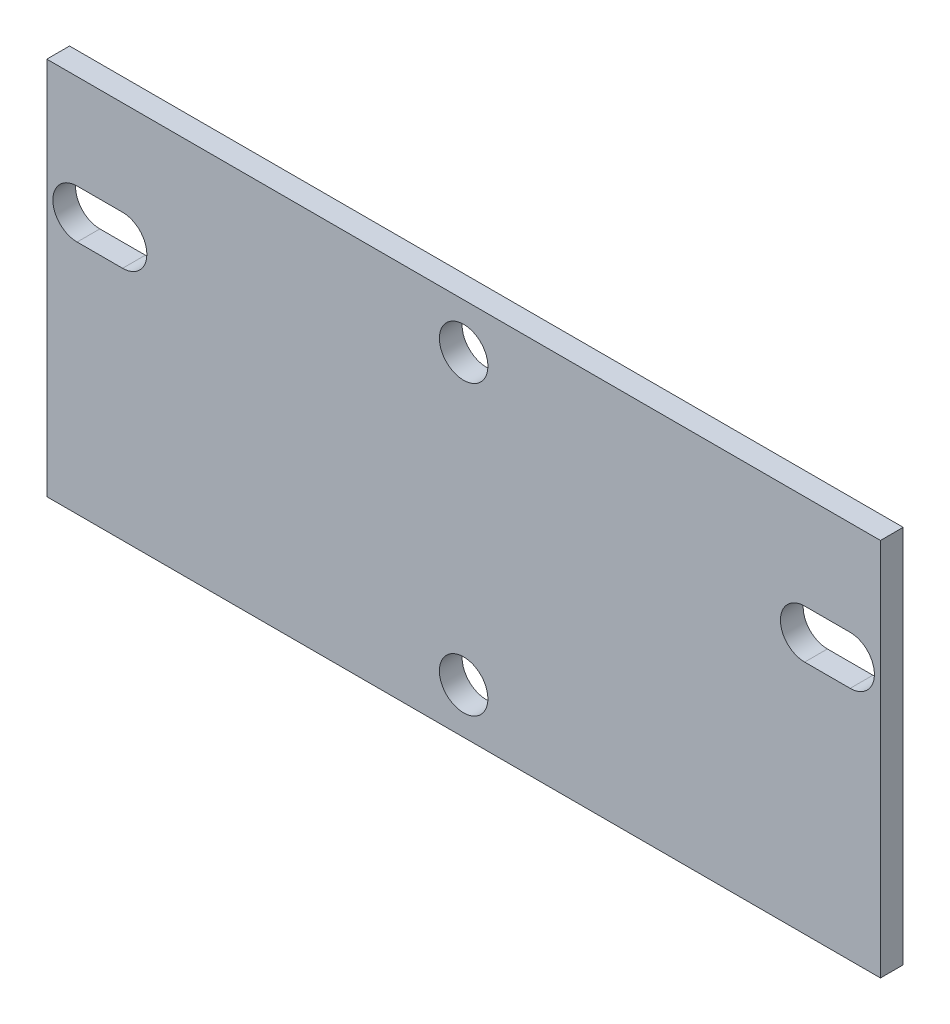
ISO-10303-21;
HEADER;
FILE_DESCRIPTION(('STEP AP214'),'2;1');
FILE_NAME('part.step','',(''),(''),'','','');
FILE_SCHEMA(('AUTOMOTIVE_DESIGN { 1 0 10303 214 1 1 1 1 }'));
ENDSEC;
DATA;
#1=APPLICATION_CONTEXT('core data for automotive mechanical design processes');
#2=APPLICATION_PROTOCOL_DEFINITION('international standard','automotive_design',2000,#1);
#3=PRODUCT_CONTEXT('',#1,'mechanical');
#4=PRODUCT('Part','Part','',(#3));
#5=PRODUCT_RELATED_PRODUCT_CATEGORY('part','',(#4));
#6=PRODUCT_DEFINITION_FORMATION('','',#4);
#7=PRODUCT_DEFINITION_CONTEXT('part definition',#1,'design');
#8=PRODUCT_DEFINITION('design','',#6,#7);
#9=PRODUCT_DEFINITION_SHAPE('','',#8);
#10=(LENGTH_UNIT() NAMED_UNIT(*) SI_UNIT(.MILLI.,.METRE.));
#11=(NAMED_UNIT(*) PLANE_ANGLE_UNIT() SI_UNIT($,.RADIAN.));
#12=(NAMED_UNIT(*) SI_UNIT($,.STERADIAN.) SOLID_ANGLE_UNIT());
#13=UNCERTAINTY_MEASURE_WITH_UNIT(LENGTH_MEASURE(1.E-05),#10,'distance_accuracy_value','');
#14=(GEOMETRIC_REPRESENTATION_CONTEXT(3) GLOBAL_UNCERTAINTY_ASSIGNED_CONTEXT((#13)) GLOBAL_UNIT_ASSIGNED_CONTEXT((#10,
#11,#12)) REPRESENTATION_CONTEXT('',''));
#15=CARTESIAN_POINT('',(0.,0.,0.));
#16=DIRECTION('',(0.,0.,1.));
#17=DIRECTION('',(1.,0.,0.));
#18=AXIS2_PLACEMENT_3D('',#15,#16,#17);
#19=CARTESIAN_POINT('',(0.,0.,1.5));
#20=DIRECTION('',(1.,0.,0.));
#21=DIRECTION('',(0.,0.,-1.));
#22=AXIS2_PLACEMENT_3D('',#19,#20,#21);
#23=PLANE('',#22);
#24=DIRECTION('',(0.,-1.,0.));
#25=VECTOR('',#24,1.);
#26=CARTESIAN_POINT('',(0.,0.,0.));
#27=LINE('',#26,#25);
#28=CARTESIAN_POINT('',(0.,25.,0.));
#29=VERTEX_POINT('',#28);
#30=CARTESIAN_POINT('',(0.,0.,0.));
#31=VERTEX_POINT('',#30);
#32=EDGE_CURVE('E162',#29,#31,#27,.T.);
#33=ORIENTED_EDGE('',*,*,#32,.T.);
#34=DIRECTION('',(0.,0.,-1.));
#35=VECTOR('',#34,1.);
#36=CARTESIAN_POINT('',(0.,0.,1.5));
#37=LINE('',#36,#35);
#38=CARTESIAN_POINT('',(0.,0.,1.5));
#39=VERTEX_POINT('',#38);
#40=EDGE_CURVE('E11',#39,#31,#37,.T.);
#41=ORIENTED_EDGE('',*,*,#40,.F.);
#42=DIRECTION('',(0.,-1.,0.));
#43=VECTOR('',#42,1.);
#44=CARTESIAN_POINT('',(0.,0.,1.5));
#45=LINE('',#44,#43);
#46=CARTESIAN_POINT('',(0.,25.,1.5));
#47=VERTEX_POINT('',#46);
#48=EDGE_CURVE('E196',#47,#39,#45,.T.);
#49=ORIENTED_EDGE('',*,*,#48,.F.);
#50=DIRECTION('',(0.,0.,-1.));
#51=VECTOR('',#50,1.);
#52=CARTESIAN_POINT('',(0.,25.,1.5));
#53=LINE('',#52,#51);
#54=EDGE_CURVE('E206',#47,#29,#53,.T.);
#55=ORIENTED_EDGE('',*,*,#54,.T.);
#56=EDGE_LOOP('',(#33,#41,#49,#55));
#57=FACE_BOUND('',#56,.T.);
#58=ADVANCED_FACE('F34',(#57),#23,.F.);
#59=CARTESIAN_POINT('',(0.,0.,1.5));
#60=DIRECTION('',(0.,1.,0.));
#61=DIRECTION('',(0.,0.,1.));
#62=AXIS2_PLACEMENT_3D('',#59,#60,#61);
#63=PLANE('',#62);
#64=DIRECTION('',(1.,0.,0.));
#65=VECTOR('',#64,1.);
#66=CARTESIAN_POINT('',(0.,0.,0.));
#67=LINE('',#66,#65);
#68=CARTESIAN_POINT('',(55.,0.,0.));
#69=VERTEX_POINT('',#68);
#70=EDGE_CURVE('E209',#31,#69,#67,.T.);
#71=ORIENTED_EDGE('',*,*,#70,.T.);
#72=DIRECTION('',(0.,0.,-1.));
#73=VECTOR('',#72,1.);
#74=CARTESIAN_POINT('',(55.,0.,1.5));
#75=LINE('',#74,#73);
#76=CARTESIAN_POINT('',(55.,0.,1.5));
#77=VERTEX_POINT('',#76);
#78=EDGE_CURVE('E41',#77,#69,#75,.T.);
#79=ORIENTED_EDGE('',*,*,#78,.F.);
#80=DIRECTION('',(1.,0.,0.));
#81=VECTOR('',#80,1.);
#82=CARTESIAN_POINT('',(0.,0.,1.5));
#83=LINE('',#82,#81);
#84=EDGE_CURVE('E199',#39,#77,#83,.T.);
#85=ORIENTED_EDGE('',*,*,#84,.F.);
#86=ORIENTED_EDGE('',*,*,#40,.T.);
#87=EDGE_LOOP('',(#71,#79,#85,#86));
#88=FACE_BOUND('',#87,.T.);
#89=ADVANCED_FACE('F238',(#88),#63,.F.);
#90=CARTESIAN_POINT('',(55.,0.,1.5));
#91=DIRECTION('',(-1.,0.,0.));
#92=DIRECTION('',(0.,0.,1.));
#93=AXIS2_PLACEMENT_3D('',#90,#91,#92);
#94=PLANE('',#93);
#95=DIRECTION('',(0.,1.,0.));
#96=VECTOR('',#95,1.);
#97=CARTESIAN_POINT('',(55.,0.,0.));
#98=LINE('',#97,#96);
#99=CARTESIAN_POINT('',(55.,25.,0.));
#100=VERTEX_POINT('',#99);
#101=EDGE_CURVE('E211',#69,#100,#98,.T.);
#102=ORIENTED_EDGE('',*,*,#101,.T.);
#103=DIRECTION('',(0.,0.,-1.));
#104=VECTOR('',#103,1.);
#105=CARTESIAN_POINT('',(55.,25.,1.5));
#106=LINE('',#105,#104);
#107=CARTESIAN_POINT('',(55.,25.,1.5));
#108=VERTEX_POINT('',#107);
#109=EDGE_CURVE('E216',#108,#100,#106,.T.);
#110=ORIENTED_EDGE('',*,*,#109,.F.);
#111=DIRECTION('',(0.,1.,0.));
#112=VECTOR('',#111,1.);
#113=CARTESIAN_POINT('',(55.,0.,1.5));
#114=LINE('',#113,#112);
#115=EDGE_CURVE('E202',#77,#108,#114,.T.);
#116=ORIENTED_EDGE('',*,*,#115,.F.);
#117=ORIENTED_EDGE('',*,*,#78,.T.);
#118=EDGE_LOOP('',(#102,#110,#116,#117));
#119=FACE_BOUND('',#118,.T.);
#120=ADVANCED_FACE('F223',(#119),#94,.F.);
#121=CARTESIAN_POINT('',(0.,25.,1.5));
#122=DIRECTION('',(0.,-1.,0.));
#123=DIRECTION('',(0.,0.,-1.));
#124=AXIS2_PLACEMENT_3D('',#121,#122,#123);
#125=PLANE('',#124);
#126=DIRECTION('',(-1.,0.,0.));
#127=VECTOR('',#126,1.);
#128=CARTESIAN_POINT('',(0.,25.,0.));
#129=LINE('',#128,#127);
#130=EDGE_CURVE('E200',#100,#29,#129,.T.);
#131=ORIENTED_EDGE('',*,*,#130,.T.);
#132=ORIENTED_EDGE('',*,*,#54,.F.);
#133=DIRECTION('',(-1.,0.,0.));
#134=VECTOR('',#133,1.);
#135=CARTESIAN_POINT('',(0.,25.,1.5));
#136=LINE('',#135,#134);
#137=EDGE_CURVE('E204',#108,#47,#136,.T.);
#138=ORIENTED_EDGE('',*,*,#137,.F.);
#139=ORIENTED_EDGE('',*,*,#109,.T.);
#140=EDGE_LOOP('',(#131,#132,#138,#139));
#141=FACE_BOUND('',#140,.T.);
#142=ADVANCED_FACE('F231',(#141),#125,.F.);
#143=CARTESIAN_POINT('',(0.,0.,1.5));
#144=DIRECTION('',(0.,0.,-1.));
#145=DIRECTION('',(-1.,0.,0.));
#146=AXIS2_PLACEMENT_3D('',#143,#144,#145);
#147=PLANE('',#146);
#148=CARTESIAN_POINT('',(27.5,22.,1.5));
#149=DIRECTION('',(0.,0.,1.));
#150=DIRECTION('',(1.,0.,0.));
#151=AXIS2_PLACEMENT_3D('',#148,#149,#150);
#152=CIRCLE('',#151,1.6);
#153=CARTESIAN_POINT('',(29.1,22.,1.5));
#154=VERTEX_POINT('',#153);
#155=EDGE_CURVE('E295',#154,#154,#152,.T.);
#156=ORIENTED_EDGE('',*,*,#155,.F.);
#157=EDGE_LOOP('',(#156));
#158=FACE_BOUND('',#157,.T.);
#159=CARTESIAN_POINT('',(27.5,3.,1.5));
#160=DIRECTION('',(0.,0.,1.));
#161=DIRECTION('',(1.,0.,0.));
#162=AXIS2_PLACEMENT_3D('',#159,#160,#161);
#163=CIRCLE('',#162,1.6);
#164=CARTESIAN_POINT('',(29.1,3.,1.5));
#165=VERTEX_POINT('',#164);
#166=EDGE_CURVE('E149',#165,#165,#163,.T.);
#167=ORIENTED_EDGE('',*,*,#166,.F.);
#168=EDGE_LOOP('',(#167));
#169=FACE_BOUND('',#168,.T.);
#170=DIRECTION('',(1.,0.,0.));
#171=VECTOR('',#170,1.);
#172=CARTESIAN_POINT('',(2.,15.55,1.5));
#173=LINE('',#172,#171);
#174=CARTESIAN_POINT('',(2.,15.55,1.5));
#175=VERTEX_POINT('',#174);
#176=CARTESIAN_POINT('',(5.,15.55,1.5));
#177=VERTEX_POINT('',#176);
#178=EDGE_CURVE('E155',#175,#177,#173,.T.);
#179=ORIENTED_EDGE('',*,*,#178,.F.);
#180=CARTESIAN_POINT('',(2.,17.15,1.5));
#181=DIRECTION('',(0.,0.,1.));
#182=DIRECTION('',(1.,0.,0.));
#183=AXIS2_PLACEMENT_3D('',#180,#181,#182);
#184=CIRCLE('',#183,1.59999999999999);
#185=CARTESIAN_POINT('',(2.,18.75,1.5));
#186=VERTEX_POINT('',#185);
#187=EDGE_CURVE('E48',#186,#175,#184,.T.);
#188=ORIENTED_EDGE('',*,*,#187,.F.);
#189=DIRECTION('',(-1.,0.,0.));
#190=VECTOR('',#189,1.);
#191=CARTESIAN_POINT('',(2.,18.75,1.5));
#192=LINE('',#191,#190);
#193=CARTESIAN_POINT('',(5.,18.75,1.5));
#194=VERTEX_POINT('',#193);
#195=EDGE_CURVE('E143',#194,#186,#192,.T.);
#196=ORIENTED_EDGE('',*,*,#195,.F.);
#197=CARTESIAN_POINT('',(5.,17.15,1.5));
#198=DIRECTION('',(0.,0.,1.));
#199=DIRECTION('',(1.,0.,0.));
#200=AXIS2_PLACEMENT_3D('',#197,#198,#199);
#201=CIRCLE('',#200,1.59999999999999);
#202=EDGE_CURVE('E146',#177,#194,#201,.T.);
#203=ORIENTED_EDGE('',*,*,#202,.F.);
#204=EDGE_LOOP('',(#179,#188,#196,#203));
#205=FACE_BOUND('',#204,.T.);
#206=DIRECTION('',(-1.,0.,0.));
#207=VECTOR('',#206,1.);
#208=CARTESIAN_POINT('',(53.,18.75,1.5));
#209=LINE('',#208,#207);
#210=CARTESIAN_POINT('',(53.,18.75,1.5));
#211=VERTEX_POINT('',#210);
#212=CARTESIAN_POINT('',(50.,18.75,1.5));
#213=VERTEX_POINT('',#212);
#214=EDGE_CURVE('E181',#211,#213,#209,.T.);
#215=ORIENTED_EDGE('',*,*,#214,.F.);
#216=CARTESIAN_POINT('',(53.,17.15,1.5));
#217=DIRECTION('',(0.,0.,1.));
#218=DIRECTION('',(-1.,0.,0.));
#219=AXIS2_PLACEMENT_3D('',#216,#217,#218);
#220=CIRCLE('',#219,1.59999999999999);
#221=CARTESIAN_POINT('',(53.,15.55,1.5));
#222=VERTEX_POINT('',#221);
#223=EDGE_CURVE('E56',#222,#211,#220,.T.);
#224=ORIENTED_EDGE('',*,*,#223,.F.);
#225=DIRECTION('',(1.,0.,0.));
#226=VECTOR('',#225,1.);
#227=CARTESIAN_POINT('',(53.,15.55,1.5));
#228=LINE('',#227,#226);
#229=CARTESIAN_POINT('',(50.,15.55,1.5));
#230=VERTEX_POINT('',#229);
#231=EDGE_CURVE('E170',#230,#222,#228,.T.);
#232=ORIENTED_EDGE('',*,*,#231,.F.);
#233=CARTESIAN_POINT('',(50.,17.15,1.5));
#234=DIRECTION('',(0.,0.,1.));
#235=DIRECTION('',(-1.,0.,0.));
#236=AXIS2_PLACEMENT_3D('',#233,#234,#235);
#237=CIRCLE('',#236,1.59999999999999);
#238=EDGE_CURVE('E185',#213,#230,#237,.T.);
#239=ORIENTED_EDGE('',*,*,#238,.F.);
#240=EDGE_LOOP('',(#215,#224,#232,#239));
#241=FACE_BOUND('',#240,.T.);
#242=ORIENTED_EDGE('',*,*,#48,.T.);
#243=ORIENTED_EDGE('',*,*,#84,.T.);
#244=ORIENTED_EDGE('',*,*,#115,.T.);
#245=ORIENTED_EDGE('',*,*,#137,.T.);
#246=EDGE_LOOP('',(#242,#243,#244,#245));
#247=FACE_BOUND('',#246,.T.);
#248=ADVANCED_FACE('F237',(#158,#169,#205,#241,#247),#147,.F.);
#249=CARTESIAN_POINT('',(0.,0.,0.));
#250=DIRECTION('',(0.,0.,-1.));
#251=DIRECTION('',(-1.,0.,0.));
#252=AXIS2_PLACEMENT_3D('',#249,#250,#251);
#253=PLANE('',#252);
#254=CARTESIAN_POINT('',(27.5,22.,0.));
#255=DIRECTION('',(0.,0.,1.));
#256=DIRECTION('',(1.,0.,0.));
#257=AXIS2_PLACEMENT_3D('',#254,#255,#256);
#258=CIRCLE('',#257,1.6);
#259=CARTESIAN_POINT('',(29.1,22.,0.));
#260=VERTEX_POINT('',#259);
#261=EDGE_CURVE('E182',#260,#260,#258,.T.);
#262=ORIENTED_EDGE('',*,*,#261,.T.);
#263=EDGE_LOOP('',(#262));
#264=FACE_BOUND('',#263,.T.);
#265=CARTESIAN_POINT('',(27.5,3.,0.));
#266=DIRECTION('',(0.,0.,1.));
#267=DIRECTION('',(1.,0.,0.));
#268=AXIS2_PLACEMENT_3D('',#265,#266,#267);
#269=CIRCLE('',#268,1.6);
#270=CARTESIAN_POINT('',(29.1,3.,0.));
#271=VERTEX_POINT('',#270);
#272=EDGE_CURVE('E296',#271,#271,#269,.T.);
#273=ORIENTED_EDGE('',*,*,#272,.T.);
#274=EDGE_LOOP('',(#273));
#275=FACE_BOUND('',#274,.T.);
#276=CARTESIAN_POINT('',(2.,17.15,0.));
#277=DIRECTION('',(0.,0.,1.));
#278=DIRECTION('',(1.,0.,0.));
#279=AXIS2_PLACEMENT_3D('',#276,#277,#278);
#280=CIRCLE('',#279,1.59999999999999);
#281=CARTESIAN_POINT('',(2.,18.75,0.));
#282=VERTEX_POINT('',#281);
#283=CARTESIAN_POINT('',(2.,15.55,0.));
#284=VERTEX_POINT('',#283);
#285=EDGE_CURVE('E124',#282,#284,#280,.T.);
#286=ORIENTED_EDGE('',*,*,#285,.T.);
#287=DIRECTION('',(1.,0.,0.));
#288=VECTOR('',#287,1.);
#289=CARTESIAN_POINT('',(2.,15.55,0.));
#290=LINE('',#289,#288);
#291=CARTESIAN_POINT('',(5.,15.55,0.));
#292=VERTEX_POINT('',#291);
#293=EDGE_CURVE('E134',#284,#292,#290,.T.);
#294=ORIENTED_EDGE('',*,*,#293,.T.);
#295=CARTESIAN_POINT('',(5.,17.15,0.));
#296=DIRECTION('',(0.,0.,1.));
#297=DIRECTION('',(1.,0.,0.));
#298=AXIS2_PLACEMENT_3D('',#295,#296,#297);
#299=CIRCLE('',#298,1.59999999999999);
#300=CARTESIAN_POINT('',(5.,18.75,0.));
#301=VERTEX_POINT('',#300);
#302=EDGE_CURVE('E138',#292,#301,#299,.T.);
#303=ORIENTED_EDGE('',*,*,#302,.T.);
#304=DIRECTION('',(-1.,0.,0.));
#305=VECTOR('',#304,1.);
#306=CARTESIAN_POINT('',(2.,18.75,0.));
#307=LINE('',#306,#305);
#308=EDGE_CURVE('E130',#301,#282,#307,.T.);
#309=ORIENTED_EDGE('',*,*,#308,.T.);
#310=EDGE_LOOP('',(#286,#294,#303,#309));
#311=FACE_BOUND('',#310,.T.);
#312=CARTESIAN_POINT('',(53.,17.15,0.));
#313=DIRECTION('',(0.,0.,1.));
#314=DIRECTION('',(-1.,0.,0.));
#315=AXIS2_PLACEMENT_3D('',#312,#313,#314);
#316=CIRCLE('',#315,1.59999999999999);
#317=CARTESIAN_POINT('',(53.,15.55,0.));
#318=VERTEX_POINT('',#317);
#319=CARTESIAN_POINT('',(53.,18.75,0.));
#320=VERTEX_POINT('',#319);
#321=EDGE_CURVE('E166',#318,#320,#316,.T.);
#322=ORIENTED_EDGE('',*,*,#321,.T.);
#323=DIRECTION('',(-1.,0.,0.));
#324=VECTOR('',#323,1.);
#325=CARTESIAN_POINT('',(53.,18.75,0.));
#326=LINE('',#325,#324);
#327=CARTESIAN_POINT('',(50.,18.75,0.));
#328=VERTEX_POINT('',#327);
#329=EDGE_CURVE('E169',#320,#328,#326,.T.);
#330=ORIENTED_EDGE('',*,*,#329,.T.);
#331=CARTESIAN_POINT('',(50.,17.15,0.));
#332=DIRECTION('',(0.,0.,1.));
#333=DIRECTION('',(-1.,0.,0.));
#334=AXIS2_PLACEMENT_3D('',#331,#332,#333);
#335=CIRCLE('',#334,1.59999999999999);
#336=CARTESIAN_POINT('',(50.,15.55,0.));
#337=VERTEX_POINT('',#336);
#338=EDGE_CURVE('E173',#328,#337,#335,.T.);
#339=ORIENTED_EDGE('',*,*,#338,.T.);
#340=DIRECTION('',(1.,0.,0.));
#341=VECTOR('',#340,1.);
#342=CARTESIAN_POINT('',(53.,15.55,0.));
#343=LINE('',#342,#341);
#344=EDGE_CURVE('E176',#337,#318,#343,.T.);
#345=ORIENTED_EDGE('',*,*,#344,.T.);
#346=EDGE_LOOP('',(#322,#330,#339,#345));
#347=FACE_BOUND('',#346,.T.);
#348=ORIENTED_EDGE('',*,*,#32,.F.);
#349=ORIENTED_EDGE('',*,*,#130,.F.);
#350=ORIENTED_EDGE('',*,*,#101,.F.);
#351=ORIENTED_EDGE('',*,*,#70,.F.);
#352=EDGE_LOOP('',(#348,#349,#350,#351));
#353=FACE_BOUND('',#352,.T.);
#354=ADVANCED_FACE('F140',(#264,#275,#311,#347,#353),#253,.T.);
#355=CARTESIAN_POINT('',(53.,17.15,0.));
#356=DIRECTION('',(0.,0.,1.));
#357=DIRECTION('',(1.,0.,0.));
#358=AXIS2_PLACEMENT_3D('',#355,#356,#357);
#359=CYLINDRICAL_SURFACE('',#358,1.59999999999999);
#360=ORIENTED_EDGE('',*,*,#223,.T.);
#361=DIRECTION('',(0.,0.,1.));
#362=VECTOR('',#361,1.);
#363=CARTESIAN_POINT('',(53.,18.75,0.));
#364=LINE('',#363,#362);
#365=EDGE_CURVE('E179',#320,#211,#364,.T.);
#366=ORIENTED_EDGE('',*,*,#365,.F.);
#367=ORIENTED_EDGE('',*,*,#321,.F.);
#368=DIRECTION('',(0.,0.,1.));
#369=VECTOR('',#368,1.);
#370=CARTESIAN_POINT('',(53.,15.55,0.));
#371=LINE('',#370,#369);
#372=EDGE_CURVE('E156',#318,#222,#371,.T.);
#373=ORIENTED_EDGE('',*,*,#372,.T.);
#374=EDGE_LOOP('',(#360,#366,#367,#373));
#375=FACE_BOUND('',#374,.T.);
#376=ADVANCED_FACE('F250',(#375),#359,.F.);
#377=CARTESIAN_POINT('',(53.,15.55,0.));
#378=DIRECTION('',(0.,-1.,0.));
#379=DIRECTION('',(1.,0.,0.));
#380=AXIS2_PLACEMENT_3D('',#377,#378,#379);
#381=PLANE('',#380);
#382=ORIENTED_EDGE('',*,*,#231,.T.);
#383=ORIENTED_EDGE('',*,*,#372,.F.);
#384=ORIENTED_EDGE('',*,*,#344,.F.);
#385=DIRECTION('',(0.,0.,1.));
#386=VECTOR('',#385,1.);
#387=CARTESIAN_POINT('',(50.,15.55,0.));
#388=LINE('',#387,#386);
#389=EDGE_CURVE('E191',#337,#230,#388,.T.);
#390=ORIENTED_EDGE('',*,*,#389,.T.);
#391=EDGE_LOOP('',(#382,#383,#384,#390));
#392=FACE_BOUND('',#391,.T.);
#393=ADVANCED_FACE('F257',(#392),#381,.F.);
#394=CARTESIAN_POINT('',(50.,17.15,0.));
#395=DIRECTION('',(0.,0.,1.));
#396=DIRECTION('',(1.,0.,0.));
#397=AXIS2_PLACEMENT_3D('',#394,#395,#396);
#398=CYLINDRICAL_SURFACE('',#397,1.59999999999999);
#399=ORIENTED_EDGE('',*,*,#238,.T.);
#400=ORIENTED_EDGE('',*,*,#389,.F.);
#401=ORIENTED_EDGE('',*,*,#338,.F.);
#402=DIRECTION('',(0.,0.,1.));
#403=VECTOR('',#402,1.);
#404=CARTESIAN_POINT('',(50.,18.75,0.));
#405=LINE('',#404,#403);
#406=EDGE_CURVE('E193',#328,#213,#405,.T.);
#407=ORIENTED_EDGE('',*,*,#406,.T.);
#408=EDGE_LOOP('',(#399,#400,#401,#407));
#409=FACE_BOUND('',#408,.T.);
#410=ADVANCED_FACE('F261',(#409),#398,.F.);
#411=CARTESIAN_POINT('',(53.,18.75,0.));
#412=DIRECTION('',(0.,1.,0.));
#413=DIRECTION('',(0.,0.,1.));
#414=AXIS2_PLACEMENT_3D('',#411,#412,#413);
#415=PLANE('',#414);
#416=ORIENTED_EDGE('',*,*,#214,.T.);
#417=ORIENTED_EDGE('',*,*,#406,.F.);
#418=ORIENTED_EDGE('',*,*,#329,.F.);
#419=ORIENTED_EDGE('',*,*,#365,.T.);
#420=EDGE_LOOP('',(#416,#417,#418,#419));
#421=FACE_BOUND('',#420,.T.);
#422=ADVANCED_FACE('F258',(#421),#415,.F.);
#423=CARTESIAN_POINT('',(2.,17.15,0.));
#424=DIRECTION('',(0.,0.,1.));
#425=DIRECTION('',(1.,0.,0.));
#426=AXIS2_PLACEMENT_3D('',#423,#424,#425);
#427=CYLINDRICAL_SURFACE('',#426,1.59999999999999);
#428=ORIENTED_EDGE('',*,*,#187,.T.);
#429=DIRECTION('',(0.,0.,1.));
#430=VECTOR('',#429,1.);
#431=CARTESIAN_POINT('',(2.,15.55,0.));
#432=LINE('',#431,#430);
#433=EDGE_CURVE('E120',#284,#175,#432,.T.);
#434=ORIENTED_EDGE('',*,*,#433,.F.);
#435=ORIENTED_EDGE('',*,*,#285,.F.);
#436=DIRECTION('',(0.,0.,1.));
#437=VECTOR('',#436,1.);
#438=CARTESIAN_POINT('',(2.,18.75,0.));
#439=LINE('',#438,#437);
#440=EDGE_CURVE('E160',#282,#186,#439,.T.);
#441=ORIENTED_EDGE('',*,*,#440,.T.);
#442=EDGE_LOOP('',(#428,#434,#435,#441));
#443=FACE_BOUND('',#442,.T.);
#444=ADVANCED_FACE('F122',(#443),#427,.F.);
#445=CARTESIAN_POINT('',(2.,18.75,0.));
#446=DIRECTION('',(0.,1.,0.));
#447=DIRECTION('',(0.,0.,1.));
#448=AXIS2_PLACEMENT_3D('',#445,#446,#447);
#449=PLANE('',#448);
#450=ORIENTED_EDGE('',*,*,#195,.T.);
#451=ORIENTED_EDGE('',*,*,#440,.F.);
#452=ORIENTED_EDGE('',*,*,#308,.F.);
#453=DIRECTION('',(0.,0.,1.));
#454=VECTOR('',#453,1.);
#455=CARTESIAN_POINT('',(5.,18.75,0.));
#456=LINE('',#455,#454);
#457=EDGE_CURVE('E163',#301,#194,#456,.T.);
#458=ORIENTED_EDGE('',*,*,#457,.T.);
#459=EDGE_LOOP('',(#450,#451,#452,#458));
#460=FACE_BOUND('',#459,.T.);
#461=ADVANCED_FACE('F271',(#460),#449,.F.);
#462=CARTESIAN_POINT('',(5.,17.15,0.));
#463=DIRECTION('',(0.,0.,1.));
#464=DIRECTION('',(1.,0.,0.));
#465=AXIS2_PLACEMENT_3D('',#462,#463,#464);
#466=CYLINDRICAL_SURFACE('',#465,1.59999999999999);
#467=ORIENTED_EDGE('',*,*,#202,.T.);
#468=ORIENTED_EDGE('',*,*,#457,.F.);
#469=ORIENTED_EDGE('',*,*,#302,.F.);
#470=DIRECTION('',(0.,0.,1.));
#471=VECTOR('',#470,1.);
#472=CARTESIAN_POINT('',(5.,15.55,0.));
#473=LINE('',#472,#471);
#474=EDGE_CURVE('E129',#292,#177,#473,.T.);
#475=ORIENTED_EDGE('',*,*,#474,.T.);
#476=EDGE_LOOP('',(#467,#468,#469,#475));
#477=FACE_BOUND('',#476,.T.);
#478=ADVANCED_FACE('F275',(#477),#466,.F.);
#479=CARTESIAN_POINT('',(2.,15.55,0.));
#480=DIRECTION('',(0.,-1.,0.));
#481=DIRECTION('',(0.,0.,-1.));
#482=AXIS2_PLACEMENT_3D('',#479,#480,#481);
#483=PLANE('',#482);
#484=ORIENTED_EDGE('',*,*,#178,.T.);
#485=ORIENTED_EDGE('',*,*,#474,.F.);
#486=ORIENTED_EDGE('',*,*,#293,.F.);
#487=ORIENTED_EDGE('',*,*,#433,.T.);
#488=EDGE_LOOP('',(#484,#485,#486,#487));
#489=FACE_BOUND('',#488,.T.);
#490=ADVANCED_FACE('F135',(#489),#483,.F.);
#491=CARTESIAN_POINT('',(27.5,3.,0.));
#492=DIRECTION('',(0.,0.,1.));
#493=DIRECTION('',(1.,0.,0.));
#494=AXIS2_PLACEMENT_3D('',#491,#492,#493);
#495=CYLINDRICAL_SURFACE('',#494,1.6);
#496=ORIENTED_EDGE('',*,*,#272,.F.);
#497=EDGE_LOOP('',(#496));
#498=FACE_BOUND('',#497,.T.);
#499=ORIENTED_EDGE('',*,*,#166,.T.);
#500=EDGE_LOOP('',(#499));
#501=FACE_BOUND('',#500,.T.);
#502=ADVANCED_FACE('F274',(#498,#501),#495,.F.);
#503=CARTESIAN_POINT('',(27.5,22.,0.));
#504=DIRECTION('',(0.,0.,1.));
#505=DIRECTION('',(1.,0.,0.));
#506=AXIS2_PLACEMENT_3D('',#503,#504,#505);
#507=CYLINDRICAL_SURFACE('',#506,1.6);
#508=ORIENTED_EDGE('',*,*,#261,.F.);
#509=EDGE_LOOP('',(#508));
#510=FACE_BOUND('',#509,.T.);
#511=ORIENTED_EDGE('',*,*,#155,.T.);
#512=EDGE_LOOP('',(#511));
#513=FACE_BOUND('',#512,.T.);
#514=ADVANCED_FACE('F284',(#510,#513),#507,.F.);
#515=CLOSED_SHELL('',(#58,#89,#120,#142,#248,#354,#376,#393,#410,#422,#444,#461,#478,#490,#502,#514));
#516=MANIFOLD_SOLID_BREP('B2',#515);
#517=ADVANCED_BREP_SHAPE_REPRESENTATION('',(#18,#516),#14);
#518=SHAPE_DEFINITION_REPRESENTATION(#9,#517);
ENDSEC;
END-ISO-10303-21;
